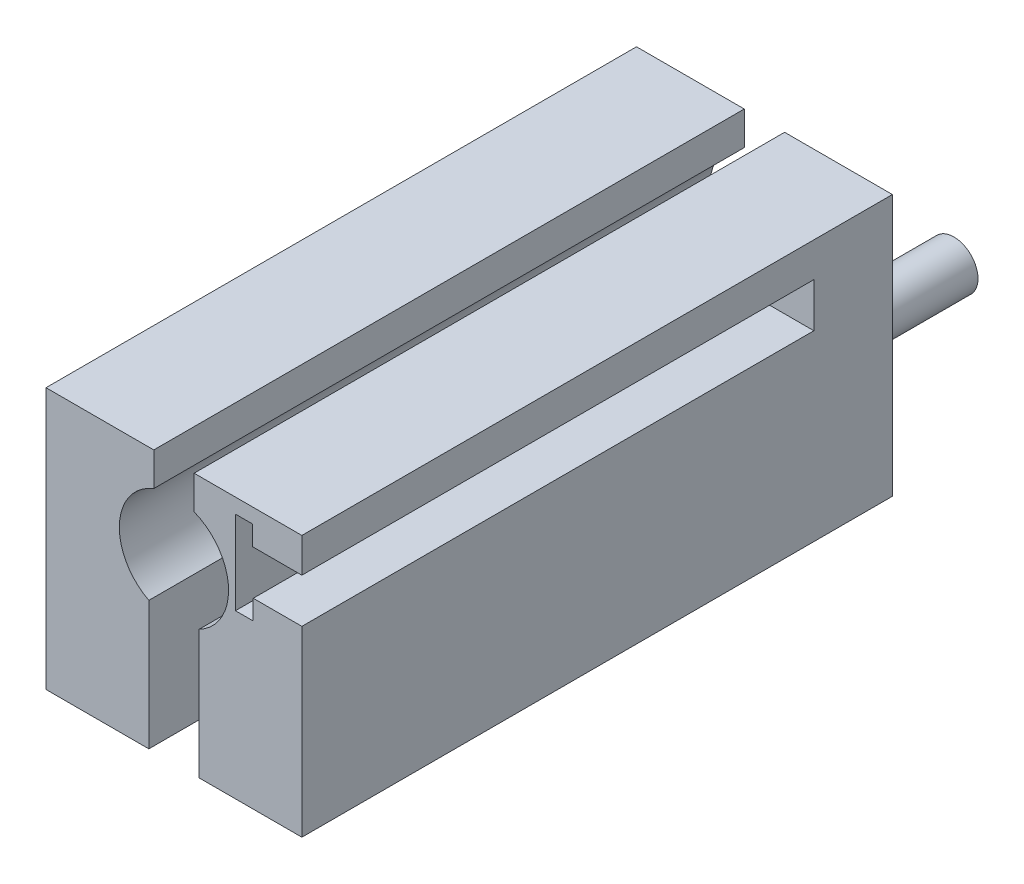
ISO-10303-21;
HEADER;
FILE_DESCRIPTION(('STEP AP214'),'2;1');
FILE_NAME('part.step','',(''),(''),'','','');
FILE_SCHEMA(('AUTOMOTIVE_DESIGN { 1 0 10303 214 1 1 1 1 }'));
ENDSEC;
DATA;
#1=APPLICATION_CONTEXT('core data for automotive mechanical design processes');
#2=APPLICATION_PROTOCOL_DEFINITION('international standard','automotive_design',2000,#1);
#3=PRODUCT_CONTEXT('',#1,'mechanical');
#4=PRODUCT('Part','Part','',(#3));
#5=PRODUCT_RELATED_PRODUCT_CATEGORY('part','',(#4));
#6=PRODUCT_DEFINITION_FORMATION('','',#4);
#7=PRODUCT_DEFINITION_CONTEXT('part definition',#1,'design');
#8=PRODUCT_DEFINITION('design','',#6,#7);
#9=PRODUCT_DEFINITION_SHAPE('','',#8);
#10=(LENGTH_UNIT() NAMED_UNIT(*) SI_UNIT(.MILLI.,.METRE.));
#11=(NAMED_UNIT(*) PLANE_ANGLE_UNIT() SI_UNIT($,.RADIAN.));
#12=(NAMED_UNIT(*) SI_UNIT($,.STERADIAN.) SOLID_ANGLE_UNIT());
#13=UNCERTAINTY_MEASURE_WITH_UNIT(LENGTH_MEASURE(1.E-05),#10,'distance_accuracy_value','');
#14=(GEOMETRIC_REPRESENTATION_CONTEXT(3) GLOBAL_UNCERTAINTY_ASSIGNED_CONTEXT((#13)) GLOBAL_UNIT_ASSIGNED_CONTEXT((#10,
#11,#12)) REPRESENTATION_CONTEXT('',''));
#15=CARTESIAN_POINT('',(0.,0.,0.));
#16=DIRECTION('',(0.,0.,1.));
#17=DIRECTION('',(1.,0.,0.));
#18=AXIS2_PLACEMENT_3D('',#15,#16,#17);
#19=CARTESIAN_POINT('',(-26.,7.5,60.));
#20=DIRECTION('',(0.,0.,-1.));
#21=DIRECTION('',(-1.,0.,0.));
#22=AXIS2_PLACEMENT_3D('',#19,#20,#21);
#23=PLANE('',#22);
#24=DIRECTION('',(0.,-1.,0.));
#25=VECTOR('',#24,1.);
#26=CARTESIAN_POINT('',(26.,7.5,60.));
#27=LINE('',#26,#25);
#28=CARTESIAN_POINT('',(26.,29.6157821907151,60.));
#29=VERTEX_POINT('',#28);
#30=CARTESIAN_POINT('',(26.,-7.5,60.));
#31=VERTEX_POINT('',#30);
#32=EDGE_CURVE('E284',#29,#31,#27,.T.);
#33=ORIENTED_EDGE('',*,*,#32,.F.);
#34=DIRECTION('',(1.,0.,0.));
#35=VECTOR('',#34,1.);
#36=CARTESIAN_POINT('',(16.1167105552871,29.6157821907151,60.));
#37=LINE('',#36,#35);
#38=CARTESIAN_POINT('',(16.1167105552871,29.6157821907151,60.));
#39=VERTEX_POINT('',#38);
#40=EDGE_CURVE('E188',#39,#29,#37,.T.);
#41=ORIENTED_EDGE('',*,*,#40,.F.);
#42=DIRECTION('',(0.,1.,0.));
#43=VECTOR('',#42,1.);
#44=CARTESIAN_POINT('',(16.1167105552871,25.6157821907151,60.));
#45=LINE('',#44,#43);
#46=CARTESIAN_POINT('',(16.1167105552871,25.6157821907151,60.));
#47=VERTEX_POINT('',#46);
#48=EDGE_CURVE('E641',#47,#39,#45,.T.);
#49=ORIENTED_EDGE('',*,*,#48,.F.);
#50=DIRECTION('',(1.,0.,0.));
#51=VECTOR('',#50,1.);
#52=CARTESIAN_POINT('',(12.5,25.6157821907151,60.));
#53=LINE('',#52,#51);
#54=CARTESIAN_POINT('',(12.5,25.6157821907151,60.));
#55=VERTEX_POINT('',#54);
#56=EDGE_CURVE('E635',#55,#47,#53,.T.);
#57=ORIENTED_EDGE('',*,*,#56,.F.);
#58=DIRECTION('',(0.,-1.,0.));
#59=VECTOR('',#58,1.);
#60=CARTESIAN_POINT('',(12.5,42.6157821907151,60.));
#61=LINE('',#60,#59);
#62=CARTESIAN_POINT('',(12.5,42.6157821907151,60.));
#63=VERTEX_POINT('',#62);
#64=EDGE_CURVE('E633',#63,#55,#61,.T.);
#65=ORIENTED_EDGE('',*,*,#64,.F.);
#66=DIRECTION('',(-1.,0.,0.));
#67=VECTOR('',#66,1.);
#68=CARTESIAN_POINT('',(16.,42.6157821907151,60.));
#69=LINE('',#68,#67);
#70=CARTESIAN_POINT('',(16.,42.6157821907151,60.));
#71=VERTEX_POINT('',#70);
#72=EDGE_CURVE('E626',#71,#63,#69,.T.);
#73=ORIENTED_EDGE('',*,*,#72,.F.);
#74=DIRECTION('',(0.,1.,0.));
#75=VECTOR('',#74,1.);
#76=CARTESIAN_POINT('',(16.,38.6157821907151,60.));
#77=LINE('',#76,#75);
#78=CARTESIAN_POINT('',(16.,38.6157821907151,60.));
#79=VERTEX_POINT('',#78);
#80=EDGE_CURVE('E623',#79,#71,#77,.T.);
#81=ORIENTED_EDGE('',*,*,#80,.F.);
#82=DIRECTION('',(-1.,0.,0.));
#83=VECTOR('',#82,1.);
#84=CARTESIAN_POINT('',(26.,38.6157821907151,60.));
#85=LINE('',#84,#83);
#86=CARTESIAN_POINT('',(26.,38.6157821907151,60.));
#87=VERTEX_POINT('',#86);
#88=EDGE_CURVE('E627',#87,#79,#85,.T.);
#89=ORIENTED_EDGE('',*,*,#88,.F.);
#90=CARTESIAN_POINT('',(26.,45.6157821907151,60.));
#91=VERTEX_POINT('',#90);
#92=EDGE_CURVE('E192',#91,#87,#27,.T.);
#93=ORIENTED_EDGE('',*,*,#92,.F.);
#94=DIRECTION('',(-1.,0.,0.));
#95=VECTOR('',#94,1.);
#96=CARTESIAN_POINT('',(0.,45.6157821907151,60.));
#97=LINE('',#96,#95);
#98=CARTESIAN_POINT('',(4.1,45.6157821907151,60.));
#99=VERTEX_POINT('',#98);
#100=EDGE_CURVE('E208',#91,#99,#97,.T.);
#101=ORIENTED_EDGE('',*,*,#100,.T.);
#102=DIRECTION('',(0.,1.,0.));
#103=VECTOR('',#102,1.);
#104=CARTESIAN_POINT('',(4.1,38.8150375665821,60.));
#105=LINE('',#104,#103);
#106=CARTESIAN_POINT('',(4.1,38.8150375665821,60.));
#107=VERTEX_POINT('',#106);
#108=EDGE_CURVE('E237',#107,#99,#105,.T.);
#109=ORIENTED_EDGE('',*,*,#108,.F.);
#110=CARTESIAN_POINT('',(0.,28.5,60.));
#111=DIRECTION('',(0.,0.,1.));
#112=DIRECTION('',(1.,0.,0.));
#113=AXIS2_PLACEMENT_3D('',#110,#111,#112);
#114=CIRCLE('',#113,11.1);
#115=CARTESIAN_POINT('',(5.1,18.640993964907,60.));
#116=VERTEX_POINT('',#115);
#117=EDGE_CURVE('E271',#116,#107,#114,.T.);
#118=ORIENTED_EDGE('',*,*,#117,.F.);
#119=DIRECTION('',(0.,1.,0.));
#120=VECTOR('',#119,1.);
#121=CARTESIAN_POINT('',(5.1,-7.5,60.));
#122=LINE('',#121,#120);
#123=CARTESIAN_POINT('',(5.1,-7.5,60.));
#124=VERTEX_POINT('',#123);
#125=EDGE_CURVE('E224',#124,#116,#122,.T.);
#126=ORIENTED_EDGE('',*,*,#125,.F.);
#127=DIRECTION('',(1.,0.,0.));
#128=VECTOR('',#127,1.);
#129=CARTESIAN_POINT('',(-26.,-7.5,60.));
#130=LINE('',#129,#128);
#131=EDGE_CURVE('E280',#124,#31,#130,.T.);
#132=ORIENTED_EDGE('',*,*,#131,.T.);
#133=EDGE_LOOP('',(#33,#41,#49,#57,#65,#73,#81,#89,#93,#101,#109,#118,#126,#132));
#134=FACE_BOUND('',#133,.T.);
#135=ADVANCED_FACE('F34',(#134),#23,.F.);
#136=CARTESIAN_POINT('',(26.,7.5,60.));
#137=DIRECTION('',(-1.,0.,0.));
#138=DIRECTION('',(0.,0.,1.));
#139=AXIS2_PLACEMENT_3D('',#136,#137,#138);
#140=PLANE('',#139);
#141=DIRECTION('',(0.,1.,0.));
#142=VECTOR('',#141,1.);
#143=CARTESIAN_POINT('',(26.,38.6157821907151,-44.0445228263563));
#144=LINE('',#143,#142);
#145=CARTESIAN_POINT('',(26.,29.6157821907151,-44.0445228263563));
#146=VERTEX_POINT('',#145);
#147=CARTESIAN_POINT('',(26.,38.6157821907151,-44.0445228263563));
#148=VERTEX_POINT('',#147);
#149=EDGE_CURVE('E182',#146,#148,#144,.T.);
#150=ORIENTED_EDGE('',*,*,#149,.F.);
#151=DIRECTION('',(0.,0.,1.));
#152=VECTOR('',#151,1.);
#153=CARTESIAN_POINT('',(26.,29.6157821907151,-44.0445228263563));
#154=LINE('',#153,#152);
#155=EDGE_CURVE('E204',#146,#29,#154,.T.);
#156=ORIENTED_EDGE('',*,*,#155,.T.);
#157=ORIENTED_EDGE('',*,*,#32,.T.);
#158=DIRECTION('',(0.,0.,-1.));
#159=VECTOR('',#158,1.);
#160=CARTESIAN_POINT('',(26.,-7.5,60.));
#161=LINE('',#160,#159);
#162=CARTESIAN_POINT('',(26.,-7.5,-60.));
#163=VERTEX_POINT('',#162);
#164=EDGE_CURVE('E270',#31,#163,#161,.T.);
#165=ORIENTED_EDGE('',*,*,#164,.T.);
#166=DIRECTION('',(0.,-1.,0.));
#167=VECTOR('',#166,1.);
#168=CARTESIAN_POINT('',(26.,7.5,-60.));
#169=LINE('',#168,#167);
#170=CARTESIAN_POINT('',(26.,45.6157821907151,-60.));
#171=VERTEX_POINT('',#170);
#172=EDGE_CURVE('E292',#171,#163,#169,.T.);
#173=ORIENTED_EDGE('',*,*,#172,.F.);
#174=DIRECTION('',(0.,0.,1.));
#175=VECTOR('',#174,1.);
#176=CARTESIAN_POINT('',(26.,45.6157821907151,-60.));
#177=LINE('',#176,#175);
#178=EDGE_CURVE('E214',#171,#91,#177,.T.);
#179=ORIENTED_EDGE('',*,*,#178,.T.);
#180=ORIENTED_EDGE('',*,*,#92,.T.);
#181=DIRECTION('',(0.,0.,1.));
#182=VECTOR('',#181,1.);
#183=CARTESIAN_POINT('',(26.,38.6157821907151,-44.0445228263563));
#184=LINE('',#183,#182);
#185=EDGE_CURVE('E176',#148,#87,#184,.T.);
#186=ORIENTED_EDGE('',*,*,#185,.F.);
#187=EDGE_LOOP('',(#150,#156,#157,#165,#173,#179,#180,#186));
#188=FACE_BOUND('',#187,.T.);
#189=ADVANCED_FACE('F36',(#188),#140,.F.);
#190=CARTESIAN_POINT('',(-26.,7.5,-60.));
#191=DIRECTION('',(0.,0.,1.));
#192=DIRECTION('',(1.,0.,0.));
#193=AXIS2_PLACEMENT_3D('',#190,#191,#192);
#194=PLANE('',#193);
#195=DIRECTION('',(1.,0.,0.));
#196=VECTOR('',#195,1.);
#197=CARTESIAN_POINT('',(-26.,45.6157821907151,-60.));
#198=LINE('',#197,#196);
#199=CARTESIAN_POINT('',(-26.,45.6157821907151,-60.));
#200=VERTEX_POINT('',#199);
#201=CARTESIAN_POINT('',(-4.1,45.6157821907151,-60.));
#202=VERTEX_POINT('',#201);
#203=EDGE_CURVE('E203',#200,#202,#198,.T.);
#204=ORIENTED_EDGE('',*,*,#203,.T.);
#205=DIRECTION('',(0.,-1.,0.));
#206=VECTOR('',#205,1.);
#207=CARTESIAN_POINT('',(-4.1,38.8150375665821,-60.));
#208=LINE('',#207,#206);
#209=CARTESIAN_POINT('',(-4.1,38.8150375665821,-60.));
#210=VERTEX_POINT('',#209);
#211=EDGE_CURVE('E251',#202,#210,#208,.T.);
#212=ORIENTED_EDGE('',*,*,#211,.T.);
#213=CARTESIAN_POINT('',(0.,28.5,-60.));
#214=DIRECTION('',(0.,0.,1.));
#215=DIRECTION('',(1.,0.,0.));
#216=AXIS2_PLACEMENT_3D('',#213,#214,#215);
#217=CIRCLE('',#216,11.1);
#218=CARTESIAN_POINT('',(4.1,38.8150375665821,-60.));
#219=VERTEX_POINT('',#218);
#220=EDGE_CURVE('E266',#210,#219,#217,.T.);
#221=ORIENTED_EDGE('',*,*,#220,.T.);
#222=DIRECTION('',(0.,1.,0.));
#223=VECTOR('',#222,1.);
#224=CARTESIAN_POINT('',(4.1,38.8150375665821,-60.));
#225=LINE('',#224,#223);
#226=CARTESIAN_POINT('',(4.1,45.6157821907151,-60.));
#227=VERTEX_POINT('',#226);
#228=EDGE_CURVE('E248',#219,#227,#225,.T.);
#229=ORIENTED_EDGE('',*,*,#228,.T.);
#230=DIRECTION('',(-1.,0.,0.));
#231=VECTOR('',#230,1.);
#232=CARTESIAN_POINT('',(0.,45.6157821907151,-60.));
#233=LINE('',#232,#231);
#234=EDGE_CURVE('E211',#171,#227,#233,.T.);
#235=ORIENTED_EDGE('',*,*,#234,.F.);
#236=ORIENTED_EDGE('',*,*,#172,.T.);
#237=DIRECTION('',(-1.,0.,0.));
#238=VECTOR('',#237,1.);
#239=CARTESIAN_POINT('',(-26.,-7.5,-60.));
#240=LINE('',#239,#238);
#241=CARTESIAN_POINT('',(-26.,-7.5,-60.));
#242=VERTEX_POINT('',#241);
#243=EDGE_CURVE('E276',#163,#242,#240,.T.);
#244=ORIENTED_EDGE('',*,*,#243,.T.);
#245=DIRECTION('',(0.,-1.,0.));
#246=VECTOR('',#245,1.);
#247=CARTESIAN_POINT('',(-26.,7.5,-60.));
#248=LINE('',#247,#246);
#249=EDGE_CURVE('E289',#200,#242,#248,.T.);
#250=ORIENTED_EDGE('',*,*,#249,.F.);
#251=EDGE_LOOP('',(#204,#212,#221,#229,#235,#236,#244,#250));
#252=FACE_BOUND('',#251,.T.);
#253=CARTESIAN_POINT('',(13.5,14.5,-60.));
#254=DIRECTION('',(0.,0.,1.));
#255=DIRECTION('',(1.,0.,0.));
#256=AXIS2_PLACEMENT_3D('',#253,#254,#255);
#257=CIRCLE('',#256,4.9);
#258=CARTESIAN_POINT('',(18.4,14.5,-60.));
#259=VERTEX_POINT('',#258);
#260=EDGE_CURVE('E11',#259,#259,#257,.F.);
#261=ORIENTED_EDGE('',*,*,#260,.F.);
#262=EDGE_LOOP('',(#261));
#263=FACE_BOUND('',#262,.T.);
#264=CARTESIAN_POINT('',(-13.5,14.5,-60.));
#265=DIRECTION('',(0.,0.,1.));
#266=DIRECTION('',(1.,0.,0.));
#267=AXIS2_PLACEMENT_3D('',#264,#265,#266);
#268=CIRCLE('',#267,4.9);
#269=CARTESIAN_POINT('',(-8.6,14.5,-60.));
#270=VERTEX_POINT('',#269);
#271=EDGE_CURVE('E42',#270,#270,#268,.F.);
#272=ORIENTED_EDGE('',*,*,#271,.F.);
#273=EDGE_LOOP('',(#272));
#274=FACE_BOUND('',#273,.T.);
#275=ADVANCED_FACE('F301',(#252,#263,#274),#194,.F.);
#276=CARTESIAN_POINT('',(-26.,7.5,60.));
#277=DIRECTION('',(1.,0.,0.));
#278=DIRECTION('',(0.,0.,-1.));
#279=AXIS2_PLACEMENT_3D('',#276,#277,#278);
#280=PLANE('',#279);
#281=DIRECTION('',(0.,0.,1.));
#282=VECTOR('',#281,1.);
#283=CARTESIAN_POINT('',(-26.,-7.5,60.));
#284=LINE('',#283,#282);
#285=CARTESIAN_POINT('',(-26.,-7.5,60.));
#286=VERTEX_POINT('',#285);
#287=EDGE_CURVE('E278',#242,#286,#284,.T.);
#288=ORIENTED_EDGE('',*,*,#287,.T.);
#289=DIRECTION('',(0.,-1.,0.));
#290=VECTOR('',#289,1.);
#291=CARTESIAN_POINT('',(-26.,7.5,60.));
#292=LINE('',#291,#290);
#293=CARTESIAN_POINT('',(-26.,45.6157821907151,60.));
#294=VERTEX_POINT('',#293);
#295=EDGE_CURVE('E286',#294,#286,#292,.T.);
#296=ORIENTED_EDGE('',*,*,#295,.F.);
#297=DIRECTION('',(0.,0.,1.));
#298=VECTOR('',#297,1.);
#299=CARTESIAN_POINT('',(-26.,45.6157821907151,-60.));
#300=LINE('',#299,#298);
#301=EDGE_CURVE('E200',#200,#294,#300,.T.);
#302=ORIENTED_EDGE('',*,*,#301,.F.);
#303=ORIENTED_EDGE('',*,*,#249,.T.);
#304=EDGE_LOOP('',(#288,#296,#302,#303));
#305=FACE_BOUND('',#304,.T.);
#306=ADVANCED_FACE('F303',(#305),#280,.F.);
#307=DIRECTION('',(0.,-1.,0.));
#308=VECTOR('',#307,1.);
#309=CARTESIAN_POINT('',(-4.1,38.8150375665821,60.));
#310=LINE('',#309,#308);
#311=CARTESIAN_POINT('',(-4.1,45.6157821907151,60.));
#312=VERTEX_POINT('',#311);
#313=CARTESIAN_POINT('',(-4.1,38.8150375665821,60.));
#314=VERTEX_POINT('',#313);
#315=EDGE_CURVE('E246',#312,#314,#310,.T.);
#316=ORIENTED_EDGE('',*,*,#315,.F.);
#317=DIRECTION('',(1.,0.,0.));
#318=VECTOR('',#317,1.);
#319=CARTESIAN_POINT('',(-26.,45.6157821907151,60.));
#320=LINE('',#319,#318);
#321=EDGE_CURVE('E205',#294,#312,#320,.T.);
#322=ORIENTED_EDGE('',*,*,#321,.F.);
#323=ORIENTED_EDGE('',*,*,#295,.T.);
#324=CARTESIAN_POINT('',(-5.1,-7.5,60.));
#325=VERTEX_POINT('',#324);
#326=EDGE_CURVE('E281',#286,#325,#130,.T.);
#327=ORIENTED_EDGE('',*,*,#326,.T.);
#328=DIRECTION('',(0.,-1.,0.));
#329=VECTOR('',#328,1.);
#330=CARTESIAN_POINT('',(-5.1,-7.5,60.));
#331=LINE('',#330,#329);
#332=CARTESIAN_POINT('',(-5.1,18.640993964907,60.));
#333=VERTEX_POINT('',#332);
#334=EDGE_CURVE('E227',#333,#325,#331,.T.);
#335=ORIENTED_EDGE('',*,*,#334,.F.);
#336=EDGE_CURVE('E267',#314,#333,#114,.T.);
#337=ORIENTED_EDGE('',*,*,#336,.F.);
#338=EDGE_LOOP('',(#316,#322,#323,#327,#335,#337));
#339=FACE_BOUND('',#338,.T.);
#340=ADVANCED_FACE('F309',(#339),#23,.F.);
#341=CARTESIAN_POINT('',(0.,-7.5,0.));
#342=DIRECTION('',(0.,-1.,0.));
#343=DIRECTION('',(0.,0.,-1.));
#344=AXIS2_PLACEMENT_3D('',#341,#342,#343);
#345=PLANE('',#344);
#346=DIRECTION('',(0.,0.,1.));
#347=VECTOR('',#346,1.);
#348=CARTESIAN_POINT('',(5.1,-7.5,-10.));
#349=LINE('',#348,#347);
#350=CARTESIAN_POINT('',(5.1,-7.5,-10.));
#351=VERTEX_POINT('',#350);
#352=EDGE_CURVE('E235',#351,#124,#349,.T.);
#353=ORIENTED_EDGE('',*,*,#352,.F.);
#354=DIRECTION('',(1.,0.,0.));
#355=VECTOR('',#354,1.);
#356=CARTESIAN_POINT('',(-5.1,-7.5,-10.));
#357=LINE('',#356,#355);
#358=CARTESIAN_POINT('',(-5.1,-7.5,-10.));
#359=VERTEX_POINT('',#358);
#360=EDGE_CURVE('E230',#359,#351,#357,.T.);
#361=ORIENTED_EDGE('',*,*,#360,.F.);
#362=DIRECTION('',(0.,0.,1.));
#363=VECTOR('',#362,1.);
#364=CARTESIAN_POINT('',(-5.1,-7.5,-10.));
#365=LINE('',#364,#363);
#366=EDGE_CURVE('E238',#359,#325,#365,.T.);
#367=ORIENTED_EDGE('',*,*,#366,.T.);
#368=ORIENTED_EDGE('',*,*,#326,.F.);
#369=ORIENTED_EDGE('',*,*,#287,.F.);
#370=ORIENTED_EDGE('',*,*,#243,.F.);
#371=ORIENTED_EDGE('',*,*,#164,.F.);
#372=ORIENTED_EDGE('',*,*,#131,.F.);
#373=EDGE_LOOP('',(#353,#361,#367,#368,#369,#370,#371,#372));
#374=FACE_BOUND('',#373,.T.);
#375=ADVANCED_FACE('F321',(#374),#345,.T.);
#376=CARTESIAN_POINT('',(0.,28.5,60.));
#377=DIRECTION('',(0.,0.,-1.));
#378=DIRECTION('',(-1.,0.,0.));
#379=AXIS2_PLACEMENT_3D('',#376,#377,#378);
#380=CYLINDRICAL_SURFACE('',#379,11.1);
#381=DIRECTION('',(0.,0.,1.));
#382=VECTOR('',#381,1.);
#383=CARTESIAN_POINT('',(5.1,18.640993964907,-10.));
#384=LINE('',#383,#382);
#385=CARTESIAN_POINT('',(5.1,18.640993964907,-10.));
#386=VERTEX_POINT('',#385);
#387=EDGE_CURVE('E232',#386,#116,#384,.T.);
#388=ORIENTED_EDGE('',*,*,#387,.T.);
#389=ORIENTED_EDGE('',*,*,#117,.T.);
#390=DIRECTION('',(0.,0.,1.));
#391=VECTOR('',#390,1.);
#392=CARTESIAN_POINT('',(4.1,38.8150375665821,-60.));
#393=LINE('',#392,#391);
#394=EDGE_CURVE('E255',#219,#107,#393,.T.);
#395=ORIENTED_EDGE('',*,*,#394,.F.);
#396=ORIENTED_EDGE('',*,*,#220,.F.);
#397=DIRECTION('',(0.,0.,1.));
#398=VECTOR('',#397,1.);
#399=CARTESIAN_POINT('',(-4.1,38.8150375665821,-60.));
#400=LINE('',#399,#398);
#401=EDGE_CURVE('E254',#210,#314,#400,.T.);
#402=ORIENTED_EDGE('',*,*,#401,.T.);
#403=ORIENTED_EDGE('',*,*,#336,.T.);
#404=DIRECTION('',(0.,0.,1.));
#405=VECTOR('',#404,1.);
#406=CARTESIAN_POINT('',(-5.1,18.640993964907,-10.));
#407=LINE('',#406,#405);
#408=CARTESIAN_POINT('',(-5.1,18.640993964907,-10.));
#409=VERTEX_POINT('',#408);
#410=EDGE_CURVE('E241',#409,#333,#407,.T.);
#411=ORIENTED_EDGE('',*,*,#410,.F.);
#412=CARTESIAN_POINT('',(0.,28.5,-10.));
#413=DIRECTION('',(0.,0.,-1.));
#414=DIRECTION('',(-1.,0.,0.));
#415=AXIS2_PLACEMENT_3D('',#412,#413,#414);
#416=CIRCLE('',#415,11.1);
#417=EDGE_CURVE('E295',#386,#409,#416,.T.);
#418=ORIENTED_EDGE('',*,*,#417,.F.);
#419=EDGE_LOOP('',(#388,#389,#395,#396,#402,#403,#411,#418));
#420=FACE_BOUND('',#419,.T.);
#421=ADVANCED_FACE('F326',(#420),#380,.F.);
#422=CARTESIAN_POINT('',(-4.1,38.8150375665821,-60.));
#423=DIRECTION('',(-1.,0.,0.));
#424=DIRECTION('',(0.,0.,1.));
#425=AXIS2_PLACEMENT_3D('',#422,#423,#424);
#426=PLANE('',#425);
#427=ORIENTED_EDGE('',*,*,#315,.T.);
#428=ORIENTED_EDGE('',*,*,#401,.F.);
#429=ORIENTED_EDGE('',*,*,#211,.F.);
#430=DIRECTION('',(0.,0.,-1.));
#431=VECTOR('',#430,1.);
#432=CARTESIAN_POINT('',(-4.1,45.6157821907151,60.));
#433=LINE('',#432,#431);
#434=EDGE_CURVE('E258',#312,#202,#433,.T.);
#435=ORIENTED_EDGE('',*,*,#434,.F.);
#436=EDGE_LOOP('',(#427,#428,#429,#435));
#437=FACE_BOUND('',#436,.T.);
#438=ADVANCED_FACE('F351',(#437),#426,.F.);
#439=CARTESIAN_POINT('',(4.1,38.8150375665821,-60.));
#440=DIRECTION('',(1.,0.,0.));
#441=DIRECTION('',(0.,0.,-1.));
#442=AXIS2_PLACEMENT_3D('',#439,#440,#441);
#443=PLANE('',#442);
#444=ORIENTED_EDGE('',*,*,#228,.F.);
#445=ORIENTED_EDGE('',*,*,#394,.T.);
#446=ORIENTED_EDGE('',*,*,#108,.T.);
#447=DIRECTION('',(0.,0.,-1.));
#448=VECTOR('',#447,1.);
#449=CARTESIAN_POINT('',(4.1,45.6157821907151,60.));
#450=LINE('',#449,#448);
#451=EDGE_CURVE('E263',#227,#99,#450,.F.);
#452=ORIENTED_EDGE('',*,*,#451,.F.);
#453=EDGE_LOOP('',(#444,#445,#446,#452));
#454=FACE_BOUND('',#453,.T.);
#455=ADVANCED_FACE('F363',(#454),#443,.F.);
#456=CARTESIAN_POINT('',(5.1,-7.5,-10.));
#457=DIRECTION('',(1.,0.,0.));
#458=DIRECTION('',(0.,0.,-1.));
#459=AXIS2_PLACEMENT_3D('',#456,#457,#458);
#460=PLANE('',#459);
#461=ORIENTED_EDGE('',*,*,#125,.T.);
#462=ORIENTED_EDGE('',*,*,#387,.F.);
#463=DIRECTION('',(0.,1.,0.));
#464=VECTOR('',#463,1.);
#465=CARTESIAN_POINT('',(5.1,-7.5,-10.));
#466=LINE('',#465,#464);
#467=EDGE_CURVE('E57',#351,#386,#466,.T.);
#468=ORIENTED_EDGE('',*,*,#467,.F.);
#469=ORIENTED_EDGE('',*,*,#352,.T.);
#470=EDGE_LOOP('',(#461,#462,#468,#469));
#471=FACE_BOUND('',#470,.T.);
#472=ADVANCED_FACE('F361',(#471),#460,.F.);
#473=CARTESIAN_POINT('',(-5.1,-7.5,-10.));
#474=DIRECTION('',(-1.,0.,0.));
#475=DIRECTION('',(0.,0.,1.));
#476=AXIS2_PLACEMENT_3D('',#473,#474,#475);
#477=PLANE('',#476);
#478=ORIENTED_EDGE('',*,*,#334,.T.);
#479=ORIENTED_EDGE('',*,*,#366,.F.);
#480=DIRECTION('',(0.,-1.,0.));
#481=VECTOR('',#480,1.);
#482=CARTESIAN_POINT('',(-5.1,-7.5,-10.));
#483=LINE('',#482,#481);
#484=EDGE_CURVE('E226',#409,#359,#483,.T.);
#485=ORIENTED_EDGE('',*,*,#484,.F.);
#486=ORIENTED_EDGE('',*,*,#410,.T.);
#487=EDGE_LOOP('',(#478,#479,#485,#486));
#488=FACE_BOUND('',#487,.T.);
#489=ADVANCED_FACE('F343',(#488),#477,.F.);
#490=CARTESIAN_POINT('',(0.,0.,-10.));
#491=DIRECTION('',(0.,0.,-1.));
#492=DIRECTION('',(-1.,0.,0.));
#493=AXIS2_PLACEMENT_3D('',#490,#491,#492);
#494=PLANE('',#493);
#495=ORIENTED_EDGE('',*,*,#417,.T.);
#496=ORIENTED_EDGE('',*,*,#484,.T.);
#497=ORIENTED_EDGE('',*,*,#360,.T.);
#498=ORIENTED_EDGE('',*,*,#467,.T.);
#499=EDGE_LOOP('',(#495,#496,#497,#498));
#500=FACE_BOUND('',#499,.T.);
#501=ADVANCED_FACE('F345',(#500),#494,.F.);
#502=CARTESIAN_POINT('',(-13.5,14.5,-85.));
#503=DIRECTION('',(0.,0.,1.));
#504=DIRECTION('',(1.,0.,0.));
#505=AXIS2_PLACEMENT_3D('',#502,#503,#504);
#506=CYLINDRICAL_SURFACE('',#505,4.9);
#507=CARTESIAN_POINT('',(-13.5,14.5,-85.));
#508=DIRECTION('',(0.,0.,-1.));
#509=DIRECTION('',(-1.,0.,0.));
#510=AXIS2_PLACEMENT_3D('',#507,#508,#509);
#511=CIRCLE('',#510,4.9);
#512=CARTESIAN_POINT('',(-18.4,14.5,-85.));
#513=VERTEX_POINT('',#512);
#514=EDGE_CURVE('E221',#513,#513,#511,.T.);
#515=ORIENTED_EDGE('',*,*,#514,.F.);
#516=EDGE_LOOP('',(#515));
#517=FACE_BOUND('',#516,.T.);
#518=ORIENTED_EDGE('',*,*,#271,.T.);
#519=EDGE_LOOP('',(#518));
#520=FACE_BOUND('',#519,.T.);
#521=ADVANCED_FACE('F299',(#517,#520),#506,.T.);
#522=CARTESIAN_POINT('',(-13.5,14.5,-85.));
#523=DIRECTION('',(0.,0.,-1.));
#524=DIRECTION('',(-1.,0.,0.));
#525=AXIS2_PLACEMENT_3D('',#522,#523,#524);
#526=PLANE('',#525);
#527=ORIENTED_EDGE('',*,*,#514,.T.);
#528=EDGE_LOOP('',(#527));
#529=FACE_BOUND('',#528,.T.);
#530=ADVANCED_FACE('F511',(#529),#526,.T.);
#531=CARTESIAN_POINT('',(13.5,14.5,-85.));
#532=DIRECTION('',(0.,0.,1.));
#533=DIRECTION('',(1.,0.,0.));
#534=AXIS2_PLACEMENT_3D('',#531,#532,#533);
#535=CYLINDRICAL_SURFACE('',#534,4.9);
#536=CARTESIAN_POINT('',(13.5,14.5,-85.));
#537=DIRECTION('',(0.,0.,-1.));
#538=DIRECTION('',(-1.,0.,0.));
#539=AXIS2_PLACEMENT_3D('',#536,#537,#538);
#540=CIRCLE('',#539,4.9);
#541=CARTESIAN_POINT('',(8.6,14.5,-85.));
#542=VERTEX_POINT('',#541);
#543=EDGE_CURVE('E218',#542,#542,#540,.T.);
#544=ORIENTED_EDGE('',*,*,#543,.F.);
#545=EDGE_LOOP('',(#544));
#546=FACE_BOUND('',#545,.T.);
#547=ORIENTED_EDGE('',*,*,#260,.T.);
#548=EDGE_LOOP('',(#547));
#549=FACE_BOUND('',#548,.T.);
#550=ADVANCED_FACE('F507',(#546,#549),#535,.T.);
#551=CARTESIAN_POINT('',(13.5,14.5,-85.));
#552=DIRECTION('',(0.,0.,-1.));
#553=DIRECTION('',(-1.,0.,0.));
#554=AXIS2_PLACEMENT_3D('',#551,#552,#553);
#555=PLANE('',#554);
#556=ORIENTED_EDGE('',*,*,#543,.T.);
#557=EDGE_LOOP('',(#556));
#558=FACE_BOUND('',#557,.T.);
#559=ADVANCED_FACE('F400',(#558),#555,.T.);
#560=CARTESIAN_POINT('',(0.,45.6157821907151,-60.));
#561=DIRECTION('',(0.,1.,0.));
#562=DIRECTION('',(0.,0.,1.));
#563=AXIS2_PLACEMENT_3D('',#560,#561,#562);
#564=PLANE('',#563);
#565=ORIENTED_EDGE('',*,*,#100,.F.);
#566=ORIENTED_EDGE('',*,*,#178,.F.);
#567=ORIENTED_EDGE('',*,*,#234,.T.);
#568=ORIENTED_EDGE('',*,*,#451,.T.);
#569=EDGE_LOOP('',(#565,#566,#567,#568));
#570=FACE_BOUND('',#569,.T.);
#571=ADVANCED_FACE('F395',(#570),#564,.T.);
#572=CARTESIAN_POINT('',(-26.,45.6157821907151,-60.));
#573=DIRECTION('',(0.,-1.,0.));
#574=DIRECTION('',(0.,0.,-1.));
#575=AXIS2_PLACEMENT_3D('',#572,#573,#574);
#576=PLANE('',#575);
#577=ORIENTED_EDGE('',*,*,#321,.T.);
#578=ORIENTED_EDGE('',*,*,#434,.T.);
#579=ORIENTED_EDGE('',*,*,#203,.F.);
#580=ORIENTED_EDGE('',*,*,#301,.T.);
#581=EDGE_LOOP('',(#577,#578,#579,#580));
#582=FACE_BOUND('',#581,.T.);
#583=ADVANCED_FACE('F334',(#582),#576,.F.);
#584=CARTESIAN_POINT('',(16.1167105552871,29.6157821907151,-44.0445228263563));
#585=DIRECTION('',(0.,-1.,0.));
#586=DIRECTION('',(0.,0.,-1.));
#587=AXIS2_PLACEMENT_3D('',#584,#585,#586);
#588=PLANE('',#587);
#589=ORIENTED_EDGE('',*,*,#40,.T.);
#590=ORIENTED_EDGE('',*,*,#155,.F.);
#591=DIRECTION('',(1.,0.,0.));
#592=VECTOR('',#591,1.);
#593=CARTESIAN_POINT('',(16.1167105552871,29.6157821907151,-44.0445228263563));
#594=LINE('',#593,#592);
#595=CARTESIAN_POINT('',(16.1167105552871,29.6157821907151,-44.0445228263563));
#596=VERTEX_POINT('',#595);
#597=EDGE_CURVE('E49',#596,#146,#594,.T.);
#598=ORIENTED_EDGE('',*,*,#597,.F.);
#599=DIRECTION('',(0.,0.,1.));
#600=VECTOR('',#599,1.);
#601=CARTESIAN_POINT('',(16.1167105552871,29.6157821907151,-44.0445228263563));
#602=LINE('',#601,#600);
#603=EDGE_CURVE('E646',#596,#39,#602,.T.);
#604=ORIENTED_EDGE('',*,*,#603,.T.);
#605=EDGE_LOOP('',(#589,#590,#598,#604));
#606=FACE_BOUND('',#605,.T.);
#607=ADVANCED_FACE('F411',(#606),#588,.F.);
#608=CARTESIAN_POINT('',(16.1167105552871,25.6157821907151,-44.0445228263563));
#609=DIRECTION('',(1.,0.,0.));
#610=DIRECTION('',(0.,0.,-1.));
#611=AXIS2_PLACEMENT_3D('',#608,#609,#610);
#612=PLANE('',#611);
#613=ORIENTED_EDGE('',*,*,#48,.T.);
#614=ORIENTED_EDGE('',*,*,#603,.F.);
#615=DIRECTION('',(0.,1.,0.));
#616=VECTOR('',#615,1.);
#617=CARTESIAN_POINT('',(16.1167105552871,25.6157821907151,-44.0445228263563));
#618=LINE('',#617,#616);
#619=CARTESIAN_POINT('',(16.1167105552871,25.6157821907151,-44.0445228263563));
#620=VERTEX_POINT('',#619);
#621=EDGE_CURVE('E196',#620,#596,#618,.T.);
#622=ORIENTED_EDGE('',*,*,#621,.F.);
#623=DIRECTION('',(0.,0.,1.));
#624=VECTOR('',#623,1.);
#625=CARTESIAN_POINT('',(16.1167105552871,25.6157821907151,-44.0445228263563));
#626=LINE('',#625,#624);
#627=EDGE_CURVE('E648',#620,#47,#626,.T.);
#628=ORIENTED_EDGE('',*,*,#627,.T.);
#629=EDGE_LOOP('',(#613,#614,#622,#628));
#630=FACE_BOUND('',#629,.T.);
#631=ADVANCED_FACE('F435',(#630),#612,.F.);
#632=CARTESIAN_POINT('',(12.5,25.6157821907151,-44.0445228263563));
#633=DIRECTION('',(0.,-1.,0.));
#634=DIRECTION('',(0.,0.,-1.));
#635=AXIS2_PLACEMENT_3D('',#632,#633,#634);
#636=PLANE('',#635);
#637=ORIENTED_EDGE('',*,*,#56,.T.);
#638=ORIENTED_EDGE('',*,*,#627,.F.);
#639=DIRECTION('',(1.,0.,0.));
#640=VECTOR('',#639,1.);
#641=CARTESIAN_POINT('',(12.5,25.6157821907151,-44.0445228263563));
#642=LINE('',#641,#640);
#643=CARTESIAN_POINT('',(12.5,25.6157821907151,-44.0445228263563));
#644=VERTEX_POINT('',#643);
#645=EDGE_CURVE('E662',#644,#620,#642,.T.);
#646=ORIENTED_EDGE('',*,*,#645,.F.);
#647=DIRECTION('',(0.,0.,1.));
#648=VECTOR('',#647,1.);
#649=CARTESIAN_POINT('',(12.5,25.6157821907151,-44.0445228263563));
#650=LINE('',#649,#648);
#651=EDGE_CURVE('E650',#644,#55,#650,.T.);
#652=ORIENTED_EDGE('',*,*,#651,.T.);
#653=EDGE_LOOP('',(#637,#638,#646,#652));
#654=FACE_BOUND('',#653,.T.);
#655=ADVANCED_FACE('F445',(#654),#636,.F.);
#656=CARTESIAN_POINT('',(12.5,42.6157821907151,-44.0445228263563));
#657=DIRECTION('',(-1.,0.,0.));
#658=DIRECTION('',(0.,-1.,0.));
#659=AXIS2_PLACEMENT_3D('',#656,#657,#658);
#660=PLANE('',#659);
#661=ORIENTED_EDGE('',*,*,#64,.T.);
#662=ORIENTED_EDGE('',*,*,#651,.F.);
#663=DIRECTION('',(0.,-1.,0.));
#664=VECTOR('',#663,1.);
#665=CARTESIAN_POINT('',(12.5,42.6157821907151,-44.0445228263563));
#666=LINE('',#665,#664);
#667=CARTESIAN_POINT('',(12.5,42.6157821907151,-44.0445228263563));
#668=VERTEX_POINT('',#667);
#669=EDGE_CURVE('E657',#668,#644,#666,.T.);
#670=ORIENTED_EDGE('',*,*,#669,.F.);
#671=DIRECTION('',(0.,0.,1.));
#672=VECTOR('',#671,1.);
#673=CARTESIAN_POINT('',(12.5,42.6157821907151,-44.0445228263563));
#674=LINE('',#673,#672);
#675=EDGE_CURVE('E652',#668,#63,#674,.T.);
#676=ORIENTED_EDGE('',*,*,#675,.T.);
#677=EDGE_LOOP('',(#661,#662,#670,#676));
#678=FACE_BOUND('',#677,.T.);
#679=ADVANCED_FACE('F455',(#678),#660,.F.);
#680=CARTESIAN_POINT('',(16.,42.6157821907151,-44.0445228263563));
#681=DIRECTION('',(0.,1.,0.));
#682=DIRECTION('',(0.,0.,1.));
#683=AXIS2_PLACEMENT_3D('',#680,#681,#682);
#684=PLANE('',#683);
#685=ORIENTED_EDGE('',*,*,#72,.T.);
#686=ORIENTED_EDGE('',*,*,#675,.F.);
#687=DIRECTION('',(-1.,0.,0.));
#688=VECTOR('',#687,1.);
#689=CARTESIAN_POINT('',(16.,42.6157821907151,-44.0445228263563));
#690=LINE('',#689,#688);
#691=CARTESIAN_POINT('',(16.,42.6157821907151,-44.0445228263563));
#692=VERTEX_POINT('',#691);
#693=EDGE_CURVE('E654',#692,#668,#690,.T.);
#694=ORIENTED_EDGE('',*,*,#693,.F.);
#695=DIRECTION('',(0.,0.,1.));
#696=VECTOR('',#695,1.);
#697=CARTESIAN_POINT('',(16.,42.6157821907151,-44.0445228263563));
#698=LINE('',#697,#696);
#699=EDGE_CURVE('E194',#692,#71,#698,.T.);
#700=ORIENTED_EDGE('',*,*,#699,.T.);
#701=EDGE_LOOP('',(#685,#686,#694,#700));
#702=FACE_BOUND('',#701,.T.);
#703=ADVANCED_FACE('F465',(#702),#684,.F.);
#704=CARTESIAN_POINT('',(16.,38.6157821907151,-44.0445228263563));
#705=DIRECTION('',(1.,0.,0.));
#706=DIRECTION('',(0.,0.,-1.));
#707=AXIS2_PLACEMENT_3D('',#704,#705,#706);
#708=PLANE('',#707);
#709=ORIENTED_EDGE('',*,*,#80,.T.);
#710=ORIENTED_EDGE('',*,*,#699,.F.);
#711=DIRECTION('',(0.,1.,0.));
#712=VECTOR('',#711,1.);
#713=CARTESIAN_POINT('',(16.,38.6157821907151,-44.0445228263563));
#714=LINE('',#713,#712);
#715=CARTESIAN_POINT('',(16.,38.6157821907151,-44.0445228263563));
#716=VERTEX_POINT('',#715);
#717=EDGE_CURVE('E181',#716,#692,#714,.T.);
#718=ORIENTED_EDGE('',*,*,#717,.F.);
#719=DIRECTION('',(0.,0.,1.));
#720=VECTOR('',#719,1.);
#721=CARTESIAN_POINT('',(16.,38.6157821907151,-44.0445228263563));
#722=LINE('',#721,#720);
#723=EDGE_CURVE('E178',#716,#79,#722,.T.);
#724=ORIENTED_EDGE('',*,*,#723,.T.);
#725=EDGE_LOOP('',(#709,#710,#718,#724));
#726=FACE_BOUND('',#725,.T.);
#727=ADVANCED_FACE('F475',(#726),#708,.F.);
#728=CARTESIAN_POINT('',(26.,38.6157821907151,-44.0445228263563));
#729=DIRECTION('',(0.,1.,0.));
#730=DIRECTION('',(0.,0.,1.));
#731=AXIS2_PLACEMENT_3D('',#728,#729,#730);
#732=PLANE('',#731);
#733=ORIENTED_EDGE('',*,*,#88,.T.);
#734=ORIENTED_EDGE('',*,*,#723,.F.);
#735=DIRECTION('',(-1.,0.,0.));
#736=VECTOR('',#735,1.);
#737=CARTESIAN_POINT('',(26.,38.6157821907151,-44.0445228263563));
#738=LINE('',#737,#736);
#739=EDGE_CURVE('E172',#148,#716,#738,.T.);
#740=ORIENTED_EDGE('',*,*,#739,.F.);
#741=ORIENTED_EDGE('',*,*,#185,.T.);
#742=EDGE_LOOP('',(#733,#734,#740,#741));
#743=FACE_BOUND('',#742,.T.);
#744=ADVANCED_FACE('F174',(#743),#732,.F.);
#745=CARTESIAN_POINT('',(0.,0.,-44.0445228263563));
#746=DIRECTION('',(0.,0.,1.));
#747=DIRECTION('',(1.,0.,0.));
#748=AXIS2_PLACEMENT_3D('',#745,#746,#747);
#749=PLANE('',#748);
#750=ORIENTED_EDGE('',*,*,#149,.T.);
#751=ORIENTED_EDGE('',*,*,#739,.T.);
#752=ORIENTED_EDGE('',*,*,#717,.T.);
#753=ORIENTED_EDGE('',*,*,#693,.T.);
#754=ORIENTED_EDGE('',*,*,#669,.T.);
#755=ORIENTED_EDGE('',*,*,#645,.T.);
#756=ORIENTED_EDGE('',*,*,#621,.T.);
#757=ORIENTED_EDGE('',*,*,#597,.T.);
#758=EDGE_LOOP('',(#750,#751,#752,#753,#754,#755,#756,#757));
#759=FACE_BOUND('',#758,.T.);
#760=ADVANCED_FACE('F185',(#759),#749,.T.);
#761=CLOSED_SHELL('',(#135,#189,#275,#306,#340,#375,#421,#438,#455,#472,#489,#501,#521,#530,
#550,#559,#571,#583,#607,#631,#655,#679,#703,#727,#744,#760));
#762=MANIFOLD_SOLID_BREP('B2',#761);
#763=ADVANCED_BREP_SHAPE_REPRESENTATION('',(#18,#762),#14);
#764=SHAPE_DEFINITION_REPRESENTATION(#9,#763);
ENDSEC;
END-ISO-10303-21;
